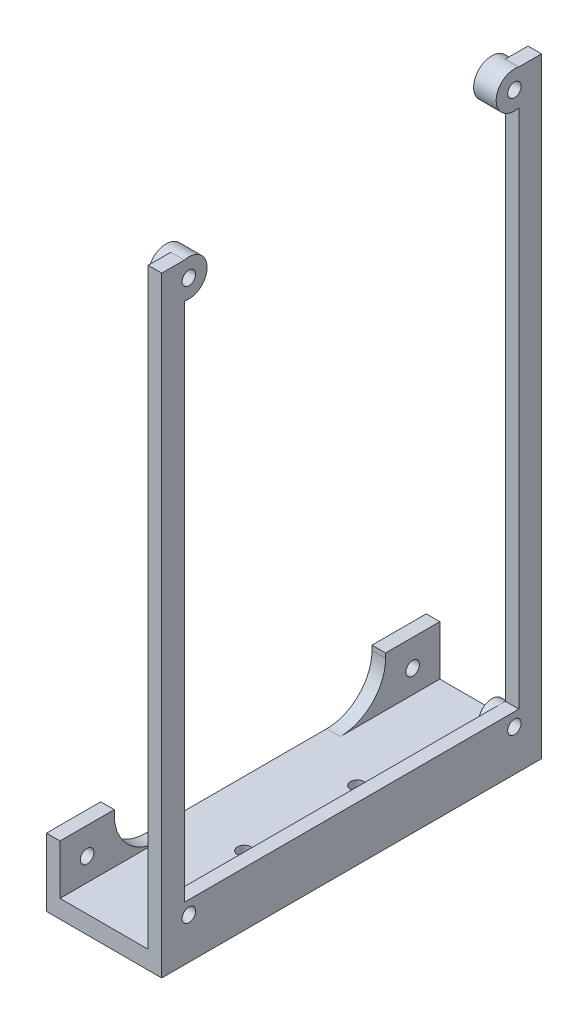
ISO-10303-21;
HEADER;
FILE_DESCRIPTION(('STEP AP214'),'2;1');
FILE_NAME('part.step','',(''),(''),'','','');
FILE_SCHEMA(('AUTOMOTIVE_DESIGN { 1 0 10303 214 1 1 1 1 }'));
ENDSEC;
DATA;
#1=APPLICATION_CONTEXT('core data for automotive mechanical design processes');
#2=APPLICATION_PROTOCOL_DEFINITION('international standard','automotive_design',2000,#1);
#3=PRODUCT_CONTEXT('',#1,'mechanical');
#4=PRODUCT('Part','Part','',(#3));
#5=PRODUCT_RELATED_PRODUCT_CATEGORY('part','',(#4));
#6=PRODUCT_DEFINITION_FORMATION('','',#4);
#7=PRODUCT_DEFINITION_CONTEXT('part definition',#1,'design');
#8=PRODUCT_DEFINITION('design','',#6,#7);
#9=PRODUCT_DEFINITION_SHAPE('','',#8);
#10=(LENGTH_UNIT() NAMED_UNIT(*) SI_UNIT(.MILLI.,.METRE.));
#11=(NAMED_UNIT(*) PLANE_ANGLE_UNIT() SI_UNIT($,.RADIAN.));
#12=(NAMED_UNIT(*) SI_UNIT($,.STERADIAN.) SOLID_ANGLE_UNIT());
#13=UNCERTAINTY_MEASURE_WITH_UNIT(LENGTH_MEASURE(1.E-05),#10,'distance_accuracy_value','');
#14=(GEOMETRIC_REPRESENTATION_CONTEXT(3) GLOBAL_UNCERTAINTY_ASSIGNED_CONTEXT((#13)) GLOBAL_UNIT_ASSIGNED_CONTEXT((#10,
#11,#12)) REPRESENTATION_CONTEXT('',''));
#15=CARTESIAN_POINT('',(0.,0.,0.));
#16=DIRECTION('',(0.,0.,1.));
#17=DIRECTION('',(1.,0.,0.));
#18=AXIS2_PLACEMENT_3D('',#15,#16,#17);
#19=CARTESIAN_POINT('',(0.,126.085239247511,78.));
#20=DIRECTION('',(1.,0.,0.));
#21=DIRECTION('',(0.,0.,-1.));
#22=AXIS2_PLACEMENT_3D('',#19,#20,#21);
#23=PLANE('',#22);
#24=DIRECTION('',(0.,0.,-1.));
#25=VECTOR('',#24,1.);
#26=CARTESIAN_POINT('',(0.,-1.,0.));
#27=LINE('',#26,#25);
#28=CARTESIAN_POINT('',(0.,-1.,84.));
#29=VERTEX_POINT('',#28);
#30=CARTESIAN_POINT('',(0.,-1.,0.));
#31=VERTEX_POINT('',#30);
#32=EDGE_CURVE('E287',#29,#31,#27,.T.);
#33=ORIENTED_EDGE('',*,*,#32,.F.);
#34=DIRECTION('',(0.,-1.,0.));
#35=VECTOR('',#34,1.);
#36=CARTESIAN_POINT('',(0.,-5.,84.));
#37=LINE('',#36,#35);
#38=CARTESIAN_POINT('',(0.,130.,84.));
#39=VERTEX_POINT('',#38);
#40=EDGE_CURVE('E354',#39,#29,#37,.T.);
#41=ORIENTED_EDGE('',*,*,#40,.F.);
#42=DIRECTION('',(0.,0.,1.));
#43=VECTOR('',#42,1.);
#44=CARTESIAN_POINT('',(0.,130.,84.));
#45=LINE('',#44,#43);
#46=CARTESIAN_POINT('',(0.,130.,79.0000000000001));
#47=VERTEX_POINT('',#46);
#48=EDGE_CURVE('E386',#47,#39,#45,.T.);
#49=ORIENTED_EDGE('',*,*,#48,.F.);
#50=CARTESIAN_POINT('',(0.,126.085239247511,78.));
#51=DIRECTION('',(-1.,0.,0.));
#52=DIRECTION('',(0.,0.,1.));
#53=AXIS2_PLACEMENT_3D('',#50,#51,#52);
#54=CIRCLE('',#53,4.04046429871923);
#55=CARTESIAN_POINT('',(0.,122.170478495023,79.));
#56=VERTEX_POINT('',#55);
#57=EDGE_CURVE('E11',#56,#47,#54,.T.);
#58=ORIENTED_EDGE('',*,*,#57,.F.);
#59=DIRECTION('',(0.,1.,0.));
#60=VECTOR('',#59,1.);
#61=CARTESIAN_POINT('',(0.,7.,79.));
#62=LINE('',#61,#60);
#63=CARTESIAN_POINT('',(0.,7.,79.));
#64=VERTEX_POINT('',#63);
#65=EDGE_CURVE('E382',#64,#56,#62,.T.);
#66=ORIENTED_EDGE('',*,*,#65,.F.);
#67=DIRECTION('',(0.,0.,1.));
#68=VECTOR('',#67,1.);
#69=CARTESIAN_POINT('',(0.,7.,5.));
#70=LINE('',#69,#68);
#71=CARTESIAN_POINT('',(0.,7.,78.));
#72=VERTEX_POINT('',#71);
#73=EDGE_CURVE('E379',#72,#64,#70,.T.);
#74=ORIENTED_EDGE('',*,*,#73,.F.);
#75=CARTESIAN_POINT('',(0.,4.08523924751169,78.));
#76=DIRECTION('',(-1.,0.,0.));
#77=DIRECTION('',(0.,0.,1.));
#78=AXIS2_PLACEMENT_3D('',#75,#76,#77);
#79=CIRCLE('',#78,2.91476075248831);
#80=EDGE_CURVE('E322',#72,#72,#79,.T.);
#81=ORIENTED_EDGE('',*,*,#80,.F.);
#82=CARTESIAN_POINT('',(0.,7.,6.00000000000001));
#83=VERTEX_POINT('',#82);
#84=EDGE_CURVE('E383',#83,#72,#70,.T.);
#85=ORIENTED_EDGE('',*,*,#84,.F.);
#86=CARTESIAN_POINT('',(0.,4.08523924751171,6.00000000000001));
#87=DIRECTION('',(-1.,0.,0.));
#88=DIRECTION('',(0.,0.,1.));
#89=AXIS2_PLACEMENT_3D('',#86,#87,#88);
#90=CIRCLE('',#89,2.91476075248829);
#91=EDGE_CURVE('E313',#83,#83,#90,.T.);
#92=ORIENTED_EDGE('',*,*,#91,.F.);
#93=CARTESIAN_POINT('',(0.,7.,5.));
#94=VERTEX_POINT('',#93);
#95=EDGE_CURVE('E380',#94,#83,#70,.T.);
#96=ORIENTED_EDGE('',*,*,#95,.F.);
#97=DIRECTION('',(0.,-1.,0.));
#98=VECTOR('',#97,1.);
#99=CARTESIAN_POINT('',(0.,7.,5.));
#100=LINE('',#99,#98);
#101=CARTESIAN_POINT('',(0.,122.170478495023,5.00000000000001));
#102=VERTEX_POINT('',#101);
#103=EDGE_CURVE('E377',#102,#94,#100,.T.);
#104=ORIENTED_EDGE('',*,*,#103,.F.);
#105=CARTESIAN_POINT('',(0.,126.085239247511,6.00000000000001));
#106=DIRECTION('',(-1.,0.,0.));
#107=DIRECTION('',(0.,0.,1.));
#108=AXIS2_PLACEMENT_3D('',#105,#106,#107);
#109=CIRCLE('',#108,4.04046429871923);
#110=CARTESIAN_POINT('',(0.,130.,4.99999999999999));
#111=VERTEX_POINT('',#110);
#112=EDGE_CURVE('E300',#111,#102,#109,.T.);
#113=ORIENTED_EDGE('',*,*,#112,.F.);
#114=DIRECTION('',(0.,0.,1.));
#115=VECTOR('',#114,1.);
#116=CARTESIAN_POINT('',(0.,130.,0.));
#117=LINE('',#116,#115);
#118=CARTESIAN_POINT('',(0.,130.,0.));
#119=VERTEX_POINT('',#118);
#120=EDGE_CURVE('E374',#119,#111,#117,.T.);
#121=ORIENTED_EDGE('',*,*,#120,.F.);
#122=DIRECTION('',(0.,1.,0.));
#123=VECTOR('',#122,1.);
#124=CARTESIAN_POINT('',(0.,12.5662912876412,0.));
#125=LINE('',#124,#123);
#126=EDGE_CURVE('E349',#31,#119,#125,.T.);
#127=ORIENTED_EDGE('',*,*,#126,.F.);
#128=EDGE_LOOP('',(#33,#41,#49,#58,#66,#74,#81,#85,#92,#96,#104,#113,#121,#127));
#129=FACE_BOUND('',#128,.T.);
#130=ADVANCED_FACE('F47',(#129),#23,.F.);
#131=CARTESIAN_POINT('',(0.,126.085239247511,6.00000000000001));
#132=DIRECTION('',(1.,0.,0.));
#133=DIRECTION('',(0.,0.,-1.));
#134=AXIS2_PLACEMENT_3D('',#131,#132,#133);
#135=CIRCLE('',#134,1.50000000000003);
#136=CARTESIAN_POINT('',(0.,126.085239247511,4.49999999999998));
#137=VERTEX_POINT('',#136);
#138=EDGE_CURVE('E340',#137,#137,#135,.T.);
#139=ORIENTED_EDGE('',*,*,#138,.T.);
#140=EDGE_LOOP('',(#139));
#141=FACE_BOUND('',#140,.T.);
#142=CARTESIAN_POINT('',(0.,126.085239247511,6.00000000000001));
#143=DIRECTION('',(-1.,0.,0.));
#144=DIRECTION('',(0.,0.,1.));
#145=AXIS2_PLACEMENT_3D('',#142,#143,#144);
#146=CIRCLE('',#145,1.50449978247794);
#147=CARTESIAN_POINT('',(0.,126.085239247511,7.50449978247794));
#148=VERTEX_POINT('',#147);
#149=EDGE_CURVE('E307',#148,#148,#146,.T.);
#150=ORIENTED_EDGE('',*,*,#149,.T.);
#151=EDGE_LOOP('',(#150));
#152=FACE_BOUND('',#151,.T.);
#153=ADVANCED_FACE('F469',(#141,#152),#23,.F.);
#154=CARTESIAN_POINT('',(3.,126.085239247511,78.));
#155=DIRECTION('',(1.,0.,0.));
#156=DIRECTION('',(0.,0.,-1.));
#157=AXIS2_PLACEMENT_3D('',#154,#155,#156);
#158=PLANE('',#157);
#159=CARTESIAN_POINT('',(3.,126.085239247511,78.));
#160=DIRECTION('',(1.,0.,0.));
#161=DIRECTION('',(0.,0.,-1.));
#162=AXIS2_PLACEMENT_3D('',#159,#160,#161);
#163=CIRCLE('',#162,1.5);
#164=CARTESIAN_POINT('',(3.,126.085239247511,76.5));
#165=VERTEX_POINT('',#164);
#166=EDGE_CURVE('E337',#165,#165,#163,.T.);
#167=ORIENTED_EDGE('',*,*,#166,.F.);
#168=EDGE_LOOP('',(#167));
#169=FACE_BOUND('',#168,.T.);
#170=CARTESIAN_POINT('',(3.,4.08523924751171,6.00000000000001));
#171=DIRECTION('',(1.,0.,0.));
#172=DIRECTION('',(0.,0.,-1.));
#173=AXIS2_PLACEMENT_3D('',#170,#171,#172);
#174=CIRCLE('',#173,1.5);
#175=CARTESIAN_POINT('',(3.,4.08523924751171,4.50000000000001));
#176=VERTEX_POINT('',#175);
#177=EDGE_CURVE('E344',#176,#176,#174,.T.);
#178=ORIENTED_EDGE('',*,*,#177,.F.);
#179=EDGE_LOOP('',(#178));
#180=FACE_BOUND('',#179,.T.);
#181=DIRECTION('',(0.,0.,-1.));
#182=VECTOR('',#181,1.);
#183=CARTESIAN_POINT('',(3.,-5.,0.));
#184=LINE('',#183,#182);
#185=CARTESIAN_POINT('',(3.,-5.,84.));
#186=VERTEX_POINT('',#185);
#187=CARTESIAN_POINT('',(3.,-5.,0.));
#188=VERTEX_POINT('',#187);
#189=EDGE_CURVE('E350',#186,#188,#184,.T.);
#190=ORIENTED_EDGE('',*,*,#189,.T.);
#191=DIRECTION('',(0.,1.,0.));
#192=VECTOR('',#191,1.);
#193=CARTESIAN_POINT('',(3.,-5.,0.));
#194=LINE('',#193,#192);
#195=CARTESIAN_POINT('',(3.,130.,0.));
#196=VERTEX_POINT('',#195);
#197=EDGE_CURVE('E353',#188,#196,#194,.T.);
#198=ORIENTED_EDGE('',*,*,#197,.T.);
#199=DIRECTION('',(0.,0.,1.));
#200=VECTOR('',#199,1.);
#201=CARTESIAN_POINT('',(3.,130.,0.));
#202=LINE('',#201,#200);
#203=CARTESIAN_POINT('',(3.,130.,5.));
#204=VERTEX_POINT('',#203);
#205=EDGE_CURVE('E356',#196,#204,#202,.T.);
#206=ORIENTED_EDGE('',*,*,#205,.T.);
#207=CARTESIAN_POINT('',(3.,126.085239247511,6.00000000000001));
#208=DIRECTION('',(1.,0.,0.));
#209=DIRECTION('',(0.,0.,-1.));
#210=AXIS2_PLACEMENT_3D('',#207,#208,#209);
#211=CIRCLE('',#210,4.04046429871923);
#212=CARTESIAN_POINT('',(3.,122.170478495023,5.00000000000001));
#213=VERTEX_POINT('',#212);
#214=EDGE_CURVE('E358',#204,#213,#211,.T.);
#215=ORIENTED_EDGE('',*,*,#214,.T.);
#216=DIRECTION('',(0.,-1.,0.));
#217=VECTOR('',#216,1.);
#218=CARTESIAN_POINT('',(3.,7.,5.));
#219=LINE('',#218,#217);
#220=CARTESIAN_POINT('',(3.,7.,5.));
#221=VERTEX_POINT('',#220);
#222=EDGE_CURVE('E360',#213,#221,#219,.T.);
#223=ORIENTED_EDGE('',*,*,#222,.T.);
#224=DIRECTION('',(0.,0.,1.));
#225=VECTOR('',#224,1.);
#226=CARTESIAN_POINT('',(3.,7.,5.));
#227=LINE('',#226,#225);
#228=CARTESIAN_POINT('',(3.,7.,79.));
#229=VERTEX_POINT('',#228);
#230=EDGE_CURVE('E362',#221,#229,#227,.T.);
#231=ORIENTED_EDGE('',*,*,#230,.T.);
#232=DIRECTION('',(0.,1.,0.));
#233=VECTOR('',#232,1.);
#234=CARTESIAN_POINT('',(3.,7.,79.));
#235=LINE('',#234,#233);
#236=CARTESIAN_POINT('',(3.,122.170478495023,79.));
#237=VERTEX_POINT('',#236);
#238=EDGE_CURVE('E364',#229,#237,#235,.T.);
#239=ORIENTED_EDGE('',*,*,#238,.T.);
#240=CARTESIAN_POINT('',(3.,126.085239247511,78.));
#241=DIRECTION('',(1.,0.,0.));
#242=DIRECTION('',(0.,0.,-1.));
#243=AXIS2_PLACEMENT_3D('',#240,#241,#242);
#244=CIRCLE('',#243,4.04046429871923);
#245=CARTESIAN_POINT('',(3.,130.,79.));
#246=VERTEX_POINT('',#245);
#247=EDGE_CURVE('E366',#237,#246,#244,.T.);
#248=ORIENTED_EDGE('',*,*,#247,.T.);
#249=DIRECTION('',(0.,0.,1.));
#250=VECTOR('',#249,1.);
#251=CARTESIAN_POINT('',(3.,130.,84.));
#252=LINE('',#251,#250);
#253=CARTESIAN_POINT('',(3.,130.,84.));
#254=VERTEX_POINT('',#253);
#255=EDGE_CURVE('E368',#246,#254,#252,.T.);
#256=ORIENTED_EDGE('',*,*,#255,.T.);
#257=DIRECTION('',(0.,-1.,0.));
#258=VECTOR('',#257,1.);
#259=CARTESIAN_POINT('',(3.,12.5662912876412,84.));
#260=LINE('',#259,#258);
#261=EDGE_CURVE('E370',#254,#186,#260,.T.);
#262=ORIENTED_EDGE('',*,*,#261,.T.);
#263=EDGE_LOOP('',(#190,#198,#206,#215,#223,#231,#239,#248,#256,#262));
#264=FACE_BOUND('',#263,.T.);
#265=CARTESIAN_POINT('',(3.,126.085239247511,6.00000000000001));
#266=DIRECTION('',(1.,0.,0.));
#267=DIRECTION('',(0.,0.,-1.));
#268=AXIS2_PLACEMENT_3D('',#265,#266,#267);
#269=CIRCLE('',#268,1.50000000000003);
#270=CARTESIAN_POINT('',(3.,126.085239247511,4.49999999999998));
#271=VERTEX_POINT('',#270);
#272=EDGE_CURVE('E341',#271,#271,#269,.T.);
#273=ORIENTED_EDGE('',*,*,#272,.F.);
#274=EDGE_LOOP('',(#273));
#275=FACE_BOUND('',#274,.T.);
#276=CARTESIAN_POINT('',(3.,4.08523924751169,78.));
#277=DIRECTION('',(1.,0.,0.));
#278=DIRECTION('',(0.,0.,-1.));
#279=AXIS2_PLACEMENT_3D('',#276,#277,#278);
#280=CIRCLE('',#279,1.5);
#281=CARTESIAN_POINT('',(3.,4.08523924751169,76.5));
#282=VERTEX_POINT('',#281);
#283=EDGE_CURVE('E333',#282,#282,#280,.T.);
#284=ORIENTED_EDGE('',*,*,#283,.F.);
#285=EDGE_LOOP('',(#284));
#286=FACE_BOUND('',#285,.T.);
#287=ADVANCED_FACE('F476',(#169,#180,#264,#275,#286),#158,.T.);
#288=CARTESIAN_POINT('',(3.,-5.,0.));
#289=DIRECTION('',(0.,1.,0.));
#290=DIRECTION('',(0.,0.,1.));
#291=AXIS2_PLACEMENT_3D('',#288,#289,#290);
#292=PLANE('',#291);
#293=CARTESIAN_POINT('',(-8.25,-5.,29.5));
#294=DIRECTION('',(0.,-1.,0.));
#295=DIRECTION('',(0.,0.,-1.));
#296=AXIS2_PLACEMENT_3D('',#293,#294,#295);
#297=CIRCLE('',#296,1.5);
#298=CARTESIAN_POINT('',(-8.25,-5.,28.));
#299=VERTEX_POINT('',#298);
#300=EDGE_CURVE('E280',#299,#299,#297,.T.);
#301=ORIENTED_EDGE('',*,*,#300,.F.);
#302=EDGE_LOOP('',(#301));
#303=FACE_BOUND('',#302,.T.);
#304=CARTESIAN_POINT('',(-8.25000000000009,-5.,54.5));
#305=DIRECTION('',(0.,-1.,0.));
#306=DIRECTION('',(0.,0.,-1.));
#307=AXIS2_PLACEMENT_3D('',#304,#305,#306);
#308=CIRCLE('',#307,1.5);
#309=CARTESIAN_POINT('',(-8.25000000000009,-5.,53.));
#310=VERTEX_POINT('',#309);
#311=EDGE_CURVE('E284',#310,#310,#308,.T.);
#312=ORIENTED_EDGE('',*,*,#311,.F.);
#313=EDGE_LOOP('',(#312));
#314=FACE_BOUND('',#313,.T.);
#315=DIRECTION('',(-1.,0.,0.));
#316=VECTOR('',#315,1.);
#317=CARTESIAN_POINT('',(3.,-5.,84.));
#318=LINE('',#317,#316);
#319=CARTESIAN_POINT('',(-22.5,-5.,84.));
#320=VERTEX_POINT('',#319);
#321=EDGE_CURVE('E372',#186,#320,#318,.T.);
#322=ORIENTED_EDGE('',*,*,#321,.T.);
#323=DIRECTION('',(0.,0.,1.));
#324=VECTOR('',#323,1.);
#325=CARTESIAN_POINT('',(-22.5,-5.,0.));
#326=LINE('',#325,#324);
#327=CARTESIAN_POINT('',(-22.5,-5.,0.));
#328=VERTEX_POINT('',#327);
#329=EDGE_CURVE('E229',#328,#320,#326,.T.);
#330=ORIENTED_EDGE('',*,*,#329,.F.);
#331=DIRECTION('',(-1.,0.,0.));
#332=VECTOR('',#331,1.);
#333=CARTESIAN_POINT('',(3.,-5.,0.));
#334=LINE('',#333,#332);
#335=EDGE_CURVE('E51',#188,#328,#334,.T.);
#336=ORIENTED_EDGE('',*,*,#335,.F.);
#337=ORIENTED_EDGE('',*,*,#189,.F.);
#338=EDGE_LOOP('',(#322,#330,#336,#337));
#339=FACE_BOUND('',#338,.T.);
#340=ADVANCED_FACE('F49',(#303,#314,#339),#292,.F.);
#341=CARTESIAN_POINT('',(3.,12.5662912876412,0.));
#342=DIRECTION('',(0.,0.,1.));
#343=DIRECTION('',(1.,0.,0.));
#344=AXIS2_PLACEMENT_3D('',#341,#342,#343);
#345=PLANE('',#344);
#346=ORIENTED_EDGE('',*,*,#335,.T.);
#347=DIRECTION('',(0.,-1.,0.));
#348=VECTOR('',#347,1.);
#349=CARTESIAN_POINT('',(-22.5,0.,0.));
#350=LINE('',#349,#348);
#351=CARTESIAN_POINT('',(-22.5,10.,0.));
#352=VERTEX_POINT('',#351);
#353=EDGE_CURVE('E226',#352,#328,#350,.T.);
#354=ORIENTED_EDGE('',*,*,#353,.F.);
#355=DIRECTION('',(1.,0.,0.));
#356=VECTOR('',#355,1.);
#357=CARTESIAN_POINT('',(-22.5,10.,0.));
#358=LINE('',#357,#356);
#359=CARTESIAN_POINT('',(-19.5,10.,0.));
#360=VERTEX_POINT('',#359);
#361=EDGE_CURVE('E272',#352,#360,#358,.T.);
#362=ORIENTED_EDGE('',*,*,#361,.T.);
#363=DIRECTION('',(0.,-1.,0.));
#364=VECTOR('',#363,1.);
#365=CARTESIAN_POINT('',(-19.5,0.,0.));
#366=LINE('',#365,#364);
#367=CARTESIAN_POINT('',(-19.5,-1.,0.));
#368=VERTEX_POINT('',#367);
#369=EDGE_CURVE('E253',#360,#368,#366,.T.);
#370=ORIENTED_EDGE('',*,*,#369,.T.);
#371=DIRECTION('',(1.,0.,0.));
#372=VECTOR('',#371,1.);
#373=CARTESIAN_POINT('',(-19.5,-1.,0.));
#374=LINE('',#373,#372);
#375=EDGE_CURVE('E293',#368,#31,#374,.T.);
#376=ORIENTED_EDGE('',*,*,#375,.T.);
#377=ORIENTED_EDGE('',*,*,#126,.T.);
#378=DIRECTION('',(-1.,0.,0.));
#379=VECTOR('',#378,1.);
#380=CARTESIAN_POINT('',(3.,130.,0.));
#381=LINE('',#380,#379);
#382=EDGE_CURVE('E412',#196,#119,#381,.T.);
#383=ORIENTED_EDGE('',*,*,#382,.F.);
#384=ORIENTED_EDGE('',*,*,#197,.F.);
#385=EDGE_LOOP('',(#346,#354,#362,#370,#376,#377,#383,#384));
#386=FACE_BOUND('',#385,.T.);
#387=ADVANCED_FACE('F421',(#386),#345,.F.);
#388=CARTESIAN_POINT('',(3.,130.,0.));
#389=DIRECTION('',(0.,-1.,0.));
#390=DIRECTION('',(0.,0.,-1.));
#391=AXIS2_PLACEMENT_3D('',#388,#389,#390);
#392=PLANE('',#391);
#393=ORIENTED_EDGE('',*,*,#120,.T.);
#394=DIRECTION('',(-1.,0.,0.));
#395=VECTOR('',#394,1.);
#396=CARTESIAN_POINT('',(3.,130.,5.));
#397=LINE('',#396,#395);
#398=EDGE_CURVE('E410',#204,#111,#397,.T.);
#399=ORIENTED_EDGE('',*,*,#398,.F.);
#400=ORIENTED_EDGE('',*,*,#205,.F.);
#401=ORIENTED_EDGE('',*,*,#382,.T.);
#402=EDGE_LOOP('',(#393,#399,#400,#401));
#403=FACE_BOUND('',#402,.T.);
#404=ADVANCED_FACE('F507',(#403),#392,.F.);
#405=CARTESIAN_POINT('',(3.,126.085239247511,6.00000000000001));
#406=DIRECTION('',(-1.,0.,0.));
#407=DIRECTION('',(0.,0.,1.));
#408=AXIS2_PLACEMENT_3D('',#405,#406,#407);
#409=CYLINDRICAL_SURFACE('',#408,4.04046429871923);
#410=ORIENTED_EDGE('',*,*,#398,.T.);
#411=ORIENTED_EDGE('',*,*,#112,.T.);
#412=DIRECTION('',(-1.,0.,0.));
#413=VECTOR('',#412,1.);
#414=CARTESIAN_POINT('',(3.,122.170478495023,5.00000000000001));
#415=LINE('',#414,#413);
#416=EDGE_CURVE('E407',#213,#102,#415,.T.);
#417=ORIENTED_EDGE('',*,*,#416,.F.);
#418=ORIENTED_EDGE('',*,*,#214,.F.);
#419=EDGE_LOOP('',(#410,#411,#417,#418));
#420=FACE_BOUND('',#419,.T.);
#421=CARTESIAN_POINT('',(-2.,126.085239247511,6.00000000000001));
#422=DIRECTION('',(-1.,0.,0.));
#423=DIRECTION('',(0.,0.,1.));
#424=AXIS2_PLACEMENT_3D('',#421,#422,#423);
#425=CIRCLE('',#424,4.04046429871923);
#426=CARTESIAN_POINT('',(-2.,126.085239247511,10.0404642987192));
#427=VERTEX_POINT('',#426);
#428=EDGE_CURVE('E303',#427,#427,#425,.T.);
#429=ORIENTED_EDGE('',*,*,#428,.F.);
#430=EDGE_LOOP('',(#429));
#431=FACE_BOUND('',#430,.T.);
#432=ADVANCED_FACE('F503',(#420,#431),#409,.T.);
#433=CARTESIAN_POINT('',(3.,7.,5.));
#434=DIRECTION('',(0.,0.,-1.));
#435=DIRECTION('',(-1.,0.,0.));
#436=AXIS2_PLACEMENT_3D('',#433,#434,#435);
#437=PLANE('',#436);
#438=ORIENTED_EDGE('',*,*,#103,.T.);
#439=DIRECTION('',(-1.,0.,0.));
#440=VECTOR('',#439,1.);
#441=CARTESIAN_POINT('',(3.,7.,5.));
#442=LINE('',#441,#440);
#443=EDGE_CURVE('E404',#221,#94,#442,.T.);
#444=ORIENTED_EDGE('',*,*,#443,.F.);
#445=ORIENTED_EDGE('',*,*,#222,.F.);
#446=ORIENTED_EDGE('',*,*,#416,.T.);
#447=EDGE_LOOP('',(#438,#444,#445,#446));
#448=FACE_BOUND('',#447,.T.);
#449=ADVANCED_FACE('F499',(#448),#437,.F.);
#450=CARTESIAN_POINT('',(3.,7.,5.));
#451=DIRECTION('',(0.,-1.,0.));
#452=DIRECTION('',(0.,0.,-1.));
#453=AXIS2_PLACEMENT_3D('',#450,#451,#452);
#454=PLANE('',#453);
#455=ORIENTED_EDGE('',*,*,#95,.T.);
#456=ORIENTED_EDGE('',*,*,#84,.T.);
#457=ORIENTED_EDGE('',*,*,#73,.T.);
#458=DIRECTION('',(-1.,0.,0.));
#459=VECTOR('',#458,1.);
#460=CARTESIAN_POINT('',(3.,7.,79.));
#461=LINE('',#460,#459);
#462=EDGE_CURVE('E401',#229,#64,#461,.T.);
#463=ORIENTED_EDGE('',*,*,#462,.F.);
#464=ORIENTED_EDGE('',*,*,#230,.F.);
#465=ORIENTED_EDGE('',*,*,#443,.T.);
#466=EDGE_LOOP('',(#455,#456,#457,#463,#464,#465));
#467=FACE_BOUND('',#466,.T.);
#468=ADVANCED_FACE('F495',(#467),#454,.F.);
#469=CARTESIAN_POINT('',(3.,7.,79.));
#470=DIRECTION('',(0.,0.,1.));
#471=DIRECTION('',(1.,0.,0.));
#472=AXIS2_PLACEMENT_3D('',#469,#470,#471);
#473=PLANE('',#472);
#474=ORIENTED_EDGE('',*,*,#65,.T.);
#475=DIRECTION('',(-1.,0.,0.));
#476=VECTOR('',#475,1.);
#477=CARTESIAN_POINT('',(3.,122.170478495023,79.));
#478=LINE('',#477,#476);
#479=EDGE_CURVE('E398',#237,#56,#478,.T.);
#480=ORIENTED_EDGE('',*,*,#479,.F.);
#481=ORIENTED_EDGE('',*,*,#238,.F.);
#482=ORIENTED_EDGE('',*,*,#462,.T.);
#483=EDGE_LOOP('',(#474,#480,#481,#482));
#484=FACE_BOUND('',#483,.T.);
#485=ADVANCED_FACE('F491',(#484),#473,.F.);
#486=CARTESIAN_POINT('',(3.,126.085239247511,78.));
#487=DIRECTION('',(-1.,0.,0.));
#488=DIRECTION('',(0.,0.,1.));
#489=AXIS2_PLACEMENT_3D('',#486,#487,#488);
#490=CYLINDRICAL_SURFACE('',#489,4.04046429871923);
#491=ORIENTED_EDGE('',*,*,#479,.T.);
#492=ORIENTED_EDGE('',*,*,#57,.T.);
#493=DIRECTION('',(-1.,0.,0.));
#494=VECTOR('',#493,1.);
#495=CARTESIAN_POINT('',(3.,130.,79.));
#496=LINE('',#495,#494);
#497=EDGE_CURVE('E395',#246,#47,#496,.T.);
#498=ORIENTED_EDGE('',*,*,#497,.F.);
#499=ORIENTED_EDGE('',*,*,#247,.F.);
#500=EDGE_LOOP('',(#491,#492,#498,#499));
#501=FACE_BOUND('',#500,.T.);
#502=CARTESIAN_POINT('',(-2.,126.085239247511,78.));
#503=DIRECTION('',(-1.,0.,0.));
#504=DIRECTION('',(0.,0.,1.));
#505=AXIS2_PLACEMENT_3D('',#502,#503,#504);
#506=CIRCLE('',#505,4.04046429871923);
#507=CARTESIAN_POINT('',(-2.,126.085239247511,82.0404642987192));
#508=VERTEX_POINT('',#507);
#509=EDGE_CURVE('E331',#508,#508,#506,.T.);
#510=ORIENTED_EDGE('',*,*,#509,.F.);
#511=EDGE_LOOP('',(#510));
#512=FACE_BOUND('',#511,.T.);
#513=ADVANCED_FACE('F487',(#501,#512),#490,.T.);
#514=CARTESIAN_POINT('',(3.,130.,84.));
#515=DIRECTION('',(0.,-1.,0.));
#516=DIRECTION('',(0.,0.,-1.));
#517=AXIS2_PLACEMENT_3D('',#514,#515,#516);
#518=PLANE('',#517);
#519=ORIENTED_EDGE('',*,*,#48,.T.);
#520=DIRECTION('',(-1.,0.,0.));
#521=VECTOR('',#520,1.);
#522=CARTESIAN_POINT('',(3.,130.,84.));
#523=LINE('',#522,#521);
#524=EDGE_CURVE('E392',#254,#39,#523,.T.);
#525=ORIENTED_EDGE('',*,*,#524,.F.);
#526=ORIENTED_EDGE('',*,*,#255,.F.);
#527=ORIENTED_EDGE('',*,*,#497,.T.);
#528=EDGE_LOOP('',(#519,#525,#526,#527));
#529=FACE_BOUND('',#528,.T.);
#530=ADVANCED_FACE('F484',(#529),#518,.F.);
#531=CARTESIAN_POINT('',(3.,-5.,84.));
#532=DIRECTION('',(0.,0.,-1.));
#533=DIRECTION('',(-1.,0.,0.));
#534=AXIS2_PLACEMENT_3D('',#531,#532,#533);
#535=PLANE('',#534);
#536=ORIENTED_EDGE('',*,*,#40,.T.);
#537=DIRECTION('',(1.,0.,0.));
#538=VECTOR('',#537,1.);
#539=CARTESIAN_POINT('',(-19.5,-1.,84.));
#540=LINE('',#539,#538);
#541=CARTESIAN_POINT('',(-19.5,-1.,84.));
#542=VERTEX_POINT('',#541);
#543=EDGE_CURVE('E297',#542,#29,#540,.T.);
#544=ORIENTED_EDGE('',*,*,#543,.F.);
#545=DIRECTION('',(0.,1.,0.));
#546=VECTOR('',#545,1.);
#547=CARTESIAN_POINT('',(-19.5,0.,84.));
#548=LINE('',#547,#546);
#549=CARTESIAN_POINT('',(-19.5,10.,84.));
#550=VERTEX_POINT('',#549);
#551=EDGE_CURVE('E256',#542,#550,#548,.T.);
#552=ORIENTED_EDGE('',*,*,#551,.T.);
#553=DIRECTION('',(1.,0.,0.));
#554=VECTOR('',#553,1.);
#555=CARTESIAN_POINT('',(-22.5,10.,84.));
#556=LINE('',#555,#554);
#557=CARTESIAN_POINT('',(-22.5,10.,84.));
#558=VERTEX_POINT('',#557);
#559=EDGE_CURVE('E269',#558,#550,#556,.T.);
#560=ORIENTED_EDGE('',*,*,#559,.F.);
#561=DIRECTION('',(0.,1.,0.));
#562=VECTOR('',#561,1.);
#563=CARTESIAN_POINT('',(-22.5,0.,84.));
#564=LINE('',#563,#562);
#565=EDGE_CURVE('E232',#320,#558,#564,.T.);
#566=ORIENTED_EDGE('',*,*,#565,.F.);
#567=ORIENTED_EDGE('',*,*,#321,.F.);
#568=ORIENTED_EDGE('',*,*,#261,.F.);
#569=ORIENTED_EDGE('',*,*,#524,.T.);
#570=EDGE_LOOP('',(#536,#544,#552,#560,#566,#567,#568,#569));
#571=FACE_BOUND('',#570,.T.);
#572=ADVANCED_FACE('F430',(#571),#535,.F.);
#573=CARTESIAN_POINT('',(3.,4.08523924751171,6.00000000000001));
#574=DIRECTION('',(-1.,0.,0.));
#575=DIRECTION('',(0.,0.,1.));
#576=AXIS2_PLACEMENT_3D('',#573,#574,#575);
#577=CYLINDRICAL_SURFACE('',#576,1.5);
#578=ORIENTED_EDGE('',*,*,#177,.T.);
#579=EDGE_LOOP('',(#578));
#580=FACE_BOUND('',#579,.T.);
#581=CARTESIAN_POINT('',(-2.,4.08523924751171,6.00000000000001));
#582=DIRECTION('',(-1.,0.,0.));
#583=DIRECTION('',(0.,0.,1.));
#584=AXIS2_PLACEMENT_3D('',#581,#582,#583);
#585=CIRCLE('',#584,1.5);
#586=CARTESIAN_POINT('',(-2.,4.08523924751171,7.50000000000001));
#587=VERTEX_POINT('',#586);
#588=EDGE_CURVE('E306',#587,#587,#585,.T.);
#589=ORIENTED_EDGE('',*,*,#588,.T.);
#590=EDGE_LOOP('',(#589));
#591=FACE_BOUND('',#590,.T.);
#592=ADVANCED_FACE('F483',(#580,#591),#577,.F.);
#593=CARTESIAN_POINT('',(3.,126.085239247511,6.00000000000001));
#594=DIRECTION('',(-1.,0.,0.));
#595=DIRECTION('',(0.,0.,1.));
#596=AXIS2_PLACEMENT_3D('',#593,#594,#595);
#597=CYLINDRICAL_SURFACE('',#596,1.50000000000003);
#598=ORIENTED_EDGE('',*,*,#272,.T.);
#599=EDGE_LOOP('',(#598));
#600=FACE_BOUND('',#599,.T.);
#601=ORIENTED_EDGE('',*,*,#138,.F.);
#602=EDGE_LOOP('',(#601));
#603=FACE_BOUND('',#602,.T.);
#604=ADVANCED_FACE('F573',(#600,#603),#597,.F.);
#605=CARTESIAN_POINT('',(3.,126.085239247511,78.));
#606=DIRECTION('',(-1.,0.,0.));
#607=DIRECTION('',(0.,0.,1.));
#608=AXIS2_PLACEMENT_3D('',#605,#606,#607);
#609=CYLINDRICAL_SURFACE('',#608,1.5);
#610=ORIENTED_EDGE('',*,*,#166,.T.);
#611=EDGE_LOOP('',(#610));
#612=FACE_BOUND('',#611,.T.);
#613=CARTESIAN_POINT('',(-2.,126.085239247511,78.));
#614=DIRECTION('',(-1.,0.,0.));
#615=DIRECTION('',(0.,0.,1.));
#616=AXIS2_PLACEMENT_3D('',#613,#614,#615);
#617=CIRCLE('',#616,1.5);
#618=CARTESIAN_POINT('',(-2.,126.085239247511,79.5));
#619=VERTEX_POINT('',#618);
#620=EDGE_CURVE('E310',#619,#619,#617,.T.);
#621=ORIENTED_EDGE('',*,*,#620,.T.);
#622=EDGE_LOOP('',(#621));
#623=FACE_BOUND('',#622,.T.);
#624=ADVANCED_FACE('F569',(#612,#623),#609,.F.);
#625=CARTESIAN_POINT('',(3.,4.08523924751169,78.));
#626=DIRECTION('',(-1.,0.,0.));
#627=DIRECTION('',(0.,0.,1.));
#628=AXIS2_PLACEMENT_3D('',#625,#626,#627);
#629=CYLINDRICAL_SURFACE('',#628,1.5);
#630=ORIENTED_EDGE('',*,*,#283,.T.);
#631=EDGE_LOOP('',(#630));
#632=FACE_BOUND('',#631,.T.);
#633=CARTESIAN_POINT('',(-2.,4.08523924751169,78.));
#634=DIRECTION('',(-1.,0.,0.));
#635=DIRECTION('',(0.,0.,1.));
#636=AXIS2_PLACEMENT_3D('',#633,#634,#635);
#637=CIRCLE('',#636,1.50000000000001);
#638=CARTESIAN_POINT('',(-2.,4.08523924751169,79.5));
#639=VERTEX_POINT('',#638);
#640=EDGE_CURVE('E319',#639,#639,#637,.T.);
#641=ORIENTED_EDGE('',*,*,#640,.T.);
#642=EDGE_LOOP('',(#641));
#643=FACE_BOUND('',#642,.T.);
#644=ADVANCED_FACE('F565',(#632,#643),#629,.F.);
#645=CARTESIAN_POINT('',(-2.,126.085239247511,78.));
#646=DIRECTION('',(-1.,0.,0.));
#647=DIRECTION('',(0.,0.,1.));
#648=AXIS2_PLACEMENT_3D('',#645,#646,#647);
#649=PLANE('',#648);
#650=ORIENTED_EDGE('',*,*,#509,.T.);
#651=EDGE_LOOP('',(#650));
#652=FACE_BOUND('',#651,.T.);
#653=ORIENTED_EDGE('',*,*,#620,.F.);
#654=EDGE_LOOP('',(#653));
#655=FACE_BOUND('',#654,.T.);
#656=ADVANCED_FACE('F547',(#652,#655),#649,.T.);
#657=CARTESIAN_POINT('',(-2.,126.085239247511,6.00000000000001));
#658=DIRECTION('',(-1.,0.,0.));
#659=DIRECTION('',(0.,0.,1.));
#660=AXIS2_PLACEMENT_3D('',#657,#658,#659);
#661=PLANE('',#660);
#662=ORIENTED_EDGE('',*,*,#428,.T.);
#663=EDGE_LOOP('',(#662));
#664=FACE_BOUND('',#663,.T.);
#665=CARTESIAN_POINT('',(-2.,126.085239247511,6.00000000000001));
#666=DIRECTION('',(-1.,0.,0.));
#667=DIRECTION('',(0.,0.,1.));
#668=AXIS2_PLACEMENT_3D('',#665,#666,#667);
#669=CIRCLE('',#668,1.50449978247794);
#670=CARTESIAN_POINT('',(-2.,126.085239247511,7.50449978247794));
#671=VERTEX_POINT('',#670);
#672=EDGE_CURVE('E302',#671,#671,#669,.T.);
#673=ORIENTED_EDGE('',*,*,#672,.F.);
#674=EDGE_LOOP('',(#673));
#675=FACE_BOUND('',#674,.T.);
#676=ADVANCED_FACE('F543',(#664,#675),#661,.T.);
#677=CARTESIAN_POINT('',(-2.,126.085239247511,6.00000000000001));
#678=DIRECTION('',(1.,0.,0.));
#679=DIRECTION('',(0.,0.,-1.));
#680=AXIS2_PLACEMENT_3D('',#677,#678,#679);
#681=CYLINDRICAL_SURFACE('',#680,1.50449978247794);
#682=ORIENTED_EDGE('',*,*,#672,.T.);
#683=EDGE_LOOP('',(#682));
#684=FACE_BOUND('',#683,.T.);
#685=ORIENTED_EDGE('',*,*,#149,.F.);
#686=EDGE_LOOP('',(#685));
#687=FACE_BOUND('',#686,.T.);
#688=ADVANCED_FACE('F546',(#684,#687),#681,.F.);
#689=CARTESIAN_POINT('',(-2.,4.08523924751171,6.00000000000001));
#690=DIRECTION('',(-1.,0.,0.));
#691=DIRECTION('',(0.,0.,1.));
#692=AXIS2_PLACEMENT_3D('',#689,#690,#691);
#693=PLANE('',#692);
#694=CARTESIAN_POINT('',(-2.,4.08523924751171,6.00000000000001));
#695=DIRECTION('',(-1.,0.,0.));
#696=DIRECTION('',(0.,0.,1.));
#697=AXIS2_PLACEMENT_3D('',#694,#695,#696);
#698=CIRCLE('',#697,2.91476075248829);
#699=CARTESIAN_POINT('',(-2.,4.08523924751171,8.9147607524883));
#700=VERTEX_POINT('',#699);
#701=EDGE_CURVE('E316',#700,#700,#698,.T.);
#702=ORIENTED_EDGE('',*,*,#701,.T.);
#703=EDGE_LOOP('',(#702));
#704=FACE_BOUND('',#703,.T.);
#705=ORIENTED_EDGE('',*,*,#588,.F.);
#706=EDGE_LOOP('',(#705));
#707=FACE_BOUND('',#706,.T.);
#708=ADVANCED_FACE('F551',(#704,#707),#693,.T.);
#709=CARTESIAN_POINT('',(-2.,4.08523924751171,6.00000000000001));
#710=DIRECTION('',(1.,0.,0.));
#711=DIRECTION('',(0.,0.,-1.));
#712=AXIS2_PLACEMENT_3D('',#709,#710,#711);
#713=CYLINDRICAL_SURFACE('',#712,2.91476075248829);
#714=ORIENTED_EDGE('',*,*,#701,.F.);
#715=EDGE_LOOP('',(#714));
#716=FACE_BOUND('',#715,.T.);
#717=ORIENTED_EDGE('',*,*,#91,.T.);
#718=EDGE_LOOP('',(#717));
#719=FACE_BOUND('',#718,.T.);
#720=ADVANCED_FACE('F553',(#716,#719),#713,.T.);
#721=CARTESIAN_POINT('',(-2.,4.08523924751169,78.));
#722=DIRECTION('',(-1.,0.,0.));
#723=DIRECTION('',(0.,0.,1.));
#724=AXIS2_PLACEMENT_3D('',#721,#722,#723);
#725=PLANE('',#724);
#726=CARTESIAN_POINT('',(-2.,4.08523924751169,78.));
#727=DIRECTION('',(-1.,0.,0.));
#728=DIRECTION('',(0.,0.,1.));
#729=AXIS2_PLACEMENT_3D('',#726,#727,#728);
#730=CIRCLE('',#729,2.91476075248831);
#731=CARTESIAN_POINT('',(-2.,4.08523924751169,80.9147607524883));
#732=VERTEX_POINT('',#731);
#733=EDGE_CURVE('E299',#732,#732,#730,.T.);
#734=ORIENTED_EDGE('',*,*,#733,.T.);
#735=EDGE_LOOP('',(#734));
#736=FACE_BOUND('',#735,.T.);
#737=ORIENTED_EDGE('',*,*,#640,.F.);
#738=EDGE_LOOP('',(#737));
#739=FACE_BOUND('',#738,.T.);
#740=ADVANCED_FACE('F537',(#736,#739),#725,.T.);
#741=CARTESIAN_POINT('',(-2.,4.08523924751169,78.));
#742=DIRECTION('',(1.,0.,0.));
#743=DIRECTION('',(0.,0.,-1.));
#744=AXIS2_PLACEMENT_3D('',#741,#742,#743);
#745=CYLINDRICAL_SURFACE('',#744,2.91476075248831);
#746=ORIENTED_EDGE('',*,*,#733,.F.);
#747=EDGE_LOOP('',(#746));
#748=FACE_BOUND('',#747,.T.);
#749=ORIENTED_EDGE('',*,*,#80,.T.);
#750=EDGE_LOOP('',(#749));
#751=FACE_BOUND('',#750,.T.);
#752=ADVANCED_FACE('F531',(#748,#751),#745,.T.);
#753=CARTESIAN_POINT('',(-19.5,-1.,0.));
#754=DIRECTION('',(0.,-1.,0.));
#755=DIRECTION('',(0.,0.,-1.));
#756=AXIS2_PLACEMENT_3D('',#753,#754,#755);
#757=PLANE('',#756);
#758=CARTESIAN_POINT('',(-8.25,-1.,29.5));
#759=DIRECTION('',(0.,-1.,0.));
#760=DIRECTION('',(0.,0.,-1.));
#761=AXIS2_PLACEMENT_3D('',#758,#759,#760);
#762=CIRCLE('',#761,1.5);
#763=CARTESIAN_POINT('',(-8.25,-1.,28.));
#764=VERTEX_POINT('',#763);
#765=EDGE_CURVE('E283',#764,#764,#762,.F.);
#766=ORIENTED_EDGE('',*,*,#765,.F.);
#767=EDGE_LOOP('',(#766));
#768=FACE_BOUND('',#767,.T.);
#769=CARTESIAN_POINT('',(-8.25000000000009,-1.,54.5));
#770=DIRECTION('',(0.,-1.,0.));
#771=DIRECTION('',(0.,0.,-1.));
#772=AXIS2_PLACEMENT_3D('',#769,#770,#771);
#773=CIRCLE('',#772,1.5);
#774=CARTESIAN_POINT('',(-8.25000000000009,-1.,53.));
#775=VERTEX_POINT('',#774);
#776=EDGE_CURVE('E201',#775,#775,#773,.F.);
#777=ORIENTED_EDGE('',*,*,#776,.F.);
#778=EDGE_LOOP('',(#777));
#779=FACE_BOUND('',#778,.T.);
#780=ORIENTED_EDGE('',*,*,#32,.T.);
#781=ORIENTED_EDGE('',*,*,#375,.F.);
#782=DIRECTION('',(0.,0.,-1.));
#783=VECTOR('',#782,1.);
#784=CARTESIAN_POINT('',(-19.5,-1.,0.));
#785=LINE('',#784,#783);
#786=CARTESIAN_POINT('',(-19.5,-0.999999999999997,22.));
#787=VERTEX_POINT('',#786);
#788=EDGE_CURVE('E63',#787,#368,#785,.T.);
#789=ORIENTED_EDGE('',*,*,#788,.F.);
#790=DIRECTION('',(1.,0.,0.));
#791=VECTOR('',#790,1.);
#792=CARTESIAN_POINT('',(-22.5,-1.,22.0000000000001));
#793=LINE('',#792,#791);
#794=CARTESIAN_POINT('',(-22.5,-1.,22.0000000000001));
#795=VERTEX_POINT('',#794);
#796=EDGE_CURVE('E202',#795,#787,#793,.T.);
#797=ORIENTED_EDGE('',*,*,#796,.F.);
#798=DIRECTION('',(0.,0.,-1.));
#799=VECTOR('',#798,1.);
#800=CARTESIAN_POINT('',(-22.5,-1.,0.));
#801=LINE('',#800,#799);
#802=CARTESIAN_POINT('',(-22.5,-1.,62.));
#803=VERTEX_POINT('',#802);
#804=EDGE_CURVE('E204',#803,#795,#801,.T.);
#805=ORIENTED_EDGE('',*,*,#804,.F.);
#806=DIRECTION('',(1.,0.,0.));
#807=VECTOR('',#806,1.);
#808=CARTESIAN_POINT('',(-22.5,-1.,62.));
#809=LINE('',#808,#807);
#810=CARTESIAN_POINT('',(-19.5,-0.999999999999997,62.));
#811=VERTEX_POINT('',#810);
#812=EDGE_CURVE('E194',#803,#811,#809,.T.);
#813=ORIENTED_EDGE('',*,*,#812,.T.);
#814=EDGE_CURVE('E71',#542,#811,#785,.T.);
#815=ORIENTED_EDGE('',*,*,#814,.F.);
#816=ORIENTED_EDGE('',*,*,#543,.T.);
#817=EDGE_LOOP('',(#780,#781,#789,#797,#805,#813,#815,#816));
#818=FACE_BOUND('',#817,.T.);
#819=ADVANCED_FACE('F205',(#768,#779,#818),#757,.F.);
#820=CARTESIAN_POINT('',(-8.25000000000009,130.126703546231,54.5));
#821=DIRECTION('',(0.,-1.,0.));
#822=DIRECTION('',(0.,0.,-1.));
#823=AXIS2_PLACEMENT_3D('',#820,#821,#822);
#824=CYLINDRICAL_SURFACE('',#823,1.5);
#825=ORIENTED_EDGE('',*,*,#311,.T.);
#826=EDGE_LOOP('',(#825));
#827=FACE_BOUND('',#826,.T.);
#828=ORIENTED_EDGE('',*,*,#776,.T.);
#829=EDGE_LOOP('',(#828));
#830=FACE_BOUND('',#829,.T.);
#831=ADVANCED_FACE('F524',(#827,#830),#824,.F.);
#832=CARTESIAN_POINT('',(-8.25,130.126703546231,29.5));
#833=DIRECTION('',(0.,-1.,0.));
#834=DIRECTION('',(0.,0.,-1.));
#835=AXIS2_PLACEMENT_3D('',#832,#833,#834);
#836=CYLINDRICAL_SURFACE('',#835,1.5);
#837=ORIENTED_EDGE('',*,*,#300,.T.);
#838=EDGE_LOOP('',(#837));
#839=FACE_BOUND('',#838,.T.);
#840=ORIENTED_EDGE('',*,*,#765,.T.);
#841=EDGE_LOOP('',(#840));
#842=FACE_BOUND('',#841,.T.);
#843=ADVANCED_FACE('F526',(#839,#842),#836,.F.);
#844=CARTESIAN_POINT('',(-19.5,0.,0.));
#845=DIRECTION('',(-1.,0.,0.));
#846=DIRECTION('',(0.,0.,1.));
#847=AXIS2_PLACEMENT_3D('',#844,#845,#846);
#848=PLANE('',#847);
#849=CARTESIAN_POINT('',(-19.5,4.08523924751195,78.));
#850=DIRECTION('',(-1.,0.,0.));
#851=DIRECTION('',(0.,0.,1.));
#852=AXIS2_PLACEMENT_3D('',#849,#850,#851);
#853=CIRCLE('',#852,1.5);
#854=CARTESIAN_POINT('',(-19.5,4.08523924751195,79.5));
#855=VERTEX_POINT('',#854);
#856=EDGE_CURVE('E217',#855,#855,#853,.T.);
#857=ORIENTED_EDGE('',*,*,#856,.T.);
#858=EDGE_LOOP('',(#857));
#859=FACE_BOUND('',#858,.T.);
#860=ORIENTED_EDGE('',*,*,#551,.F.);
#861=ORIENTED_EDGE('',*,*,#814,.T.);
#862=CARTESIAN_POINT('',(-19.5,8.99999999999999,62.));
#863=DIRECTION('',(-1.,0.,0.));
#864=DIRECTION('',(0.,0.,1.));
#865=AXIS2_PLACEMENT_3D('',#862,#863,#864);
#866=CIRCLE('',#865,10.);
#867=CARTESIAN_POINT('',(-19.5,9.00000000000006,72.));
#868=VERTEX_POINT('',#867);
#869=EDGE_CURVE('E200',#811,#868,#866,.T.);
#870=ORIENTED_EDGE('',*,*,#869,.T.);
#871=DIRECTION('',(0.,1.,0.));
#872=VECTOR('',#871,1.);
#873=CARTESIAN_POINT('',(-19.5,0.,72.));
#874=LINE('',#873,#872);
#875=CARTESIAN_POINT('',(-19.5,10.,72.));
#876=VERTEX_POINT('',#875);
#877=EDGE_CURVE('E261',#868,#876,#874,.T.);
#878=ORIENTED_EDGE('',*,*,#877,.T.);
#879=DIRECTION('',(0.,0.,-1.));
#880=VECTOR('',#879,1.);
#881=CARTESIAN_POINT('',(-19.5,9.99999999999999,0.));
#882=LINE('',#881,#880);
#883=EDGE_CURVE('E258',#550,#876,#882,.T.);
#884=ORIENTED_EDGE('',*,*,#883,.F.);
#885=EDGE_LOOP('',(#860,#861,#870,#878,#884));
#886=FACE_BOUND('',#885,.T.);
#887=ADVANCED_FACE('F440',(#859,#886),#848,.F.);
#888=CARTESIAN_POINT('',(-19.5,4.08523924751171,6.00000000000001));
#889=DIRECTION('',(-1.,0.,0.));
#890=DIRECTION('',(0.,0.,1.));
#891=AXIS2_PLACEMENT_3D('',#888,#889,#890);
#892=CIRCLE('',#891,1.5);
#893=CARTESIAN_POINT('',(-19.5,4.08523924751171,7.50000000000001));
#894=VERTEX_POINT('',#893);
#895=EDGE_CURVE('E214',#894,#894,#892,.T.);
#896=ORIENTED_EDGE('',*,*,#895,.T.);
#897=EDGE_LOOP('',(#896));
#898=FACE_BOUND('',#897,.T.);
#899=CARTESIAN_POINT('',(-19.5,8.99999999999999,22.));
#900=DIRECTION('',(-1.,0.,0.));
#901=DIRECTION('',(0.,0.,1.));
#902=AXIS2_PLACEMENT_3D('',#899,#900,#901);
#903=CIRCLE('',#902,10.);
#904=CARTESIAN_POINT('',(-19.5,9.00000000000006,12.));
#905=VERTEX_POINT('',#904);
#906=EDGE_CURVE('E245',#787,#905,#903,.F.);
#907=ORIENTED_EDGE('',*,*,#906,.F.);
#908=ORIENTED_EDGE('',*,*,#788,.T.);
#909=ORIENTED_EDGE('',*,*,#369,.F.);
#910=DIRECTION('',(0.,0.,1.));
#911=VECTOR('',#910,1.);
#912=CARTESIAN_POINT('',(-19.5,10.,0.));
#913=LINE('',#912,#911);
#914=CARTESIAN_POINT('',(-19.5,10.,12.));
#915=VERTEX_POINT('',#914);
#916=EDGE_CURVE('E250',#360,#915,#913,.T.);
#917=ORIENTED_EDGE('',*,*,#916,.T.);
#918=DIRECTION('',(0.,1.,0.));
#919=VECTOR('',#918,1.);
#920=CARTESIAN_POINT('',(-19.5,0.,12.));
#921=LINE('',#920,#919);
#922=EDGE_CURVE('E247',#905,#915,#921,.T.);
#923=ORIENTED_EDGE('',*,*,#922,.F.);
#924=EDGE_LOOP('',(#907,#908,#909,#917,#923));
#925=FACE_BOUND('',#924,.T.);
#926=ADVANCED_FACE('F447',(#898,#925),#848,.F.);
#927=CARTESIAN_POINT('',(-22.5,8.99999999999999,62.));
#928=DIRECTION('',(1.,0.,0.));
#929=DIRECTION('',(0.,0.,-1.));
#930=AXIS2_PLACEMENT_3D('',#927,#928,#929);
#931=CYLINDRICAL_SURFACE('',#930,10.);
#932=ORIENTED_EDGE('',*,*,#869,.F.);
#933=ORIENTED_EDGE('',*,*,#812,.F.);
#934=CARTESIAN_POINT('',(-22.5,8.99999999999999,62.));
#935=DIRECTION('',(-1.,0.,0.));
#936=DIRECTION('',(0.,0.,1.));
#937=AXIS2_PLACEMENT_3D('',#934,#935,#936);
#938=CIRCLE('',#937,10.);
#939=CARTESIAN_POINT('',(-22.5,9.00000000000006,72.));
#940=VERTEX_POINT('',#939);
#941=EDGE_CURVE('E198',#803,#940,#938,.T.);
#942=ORIENTED_EDGE('',*,*,#941,.T.);
#943=DIRECTION('',(1.,0.,0.));
#944=VECTOR('',#943,1.);
#945=CARTESIAN_POINT('',(-22.5,9.00000000000006,72.));
#946=LINE('',#945,#944);
#947=EDGE_CURVE('E243',#940,#868,#946,.T.);
#948=ORIENTED_EDGE('',*,*,#947,.T.);
#949=EDGE_LOOP('',(#932,#933,#942,#948));
#950=FACE_BOUND('',#949,.T.);
#951=ADVANCED_FACE('F196',(#950),#931,.F.);
#952=CARTESIAN_POINT('',(-22.5,8.99999999999999,22.));
#953=DIRECTION('',(1.,0.,0.));
#954=DIRECTION('',(0.,0.,-1.));
#955=AXIS2_PLACEMENT_3D('',#952,#953,#954);
#956=CYLINDRICAL_SURFACE('',#955,10.);
#957=ORIENTED_EDGE('',*,*,#906,.T.);
#958=DIRECTION('',(1.,0.,0.));
#959=VECTOR('',#958,1.);
#960=CARTESIAN_POINT('',(-22.5,9.00000000000006,12.));
#961=LINE('',#960,#959);
#962=CARTESIAN_POINT('',(-22.5,9.00000000000006,12.));
#963=VERTEX_POINT('',#962);
#964=EDGE_CURVE('E276',#963,#905,#961,.T.);
#965=ORIENTED_EDGE('',*,*,#964,.F.);
#966=CARTESIAN_POINT('',(-22.5,8.99999999999999,22.));
#967=DIRECTION('',(-1.,0.,0.));
#968=DIRECTION('',(0.,0.,1.));
#969=AXIS2_PLACEMENT_3D('',#966,#967,#968);
#970=CIRCLE('',#969,10.);
#971=EDGE_CURVE('E208',#795,#963,#970,.F.);
#972=ORIENTED_EDGE('',*,*,#971,.F.);
#973=ORIENTED_EDGE('',*,*,#796,.T.);
#974=EDGE_LOOP('',(#957,#965,#972,#973));
#975=FACE_BOUND('',#974,.T.);
#976=ADVANCED_FACE('F452',(#975),#956,.F.);
#977=CARTESIAN_POINT('',(-22.5,0.,12.));
#978=DIRECTION('',(0.,0.,-1.));
#979=DIRECTION('',(-1.,0.,0.));
#980=AXIS2_PLACEMENT_3D('',#977,#978,#979);
#981=PLANE('',#980);
#982=ORIENTED_EDGE('',*,*,#922,.T.);
#983=DIRECTION('',(1.,0.,0.));
#984=VECTOR('',#983,1.);
#985=CARTESIAN_POINT('',(-22.5,10.,12.));
#986=LINE('',#985,#984);
#987=CARTESIAN_POINT('',(-22.5,10.,12.));
#988=VERTEX_POINT('',#987);
#989=EDGE_CURVE('E274',#988,#915,#986,.T.);
#990=ORIENTED_EDGE('',*,*,#989,.F.);
#991=DIRECTION('',(0.,1.,0.));
#992=VECTOR('',#991,1.);
#993=CARTESIAN_POINT('',(-22.5,0.,12.));
#994=LINE('',#993,#992);
#995=EDGE_CURVE('E221',#963,#988,#994,.T.);
#996=ORIENTED_EDGE('',*,*,#995,.F.);
#997=ORIENTED_EDGE('',*,*,#964,.T.);
#998=EDGE_LOOP('',(#982,#990,#996,#997));
#999=FACE_BOUND('',#998,.T.);
#1000=ADVANCED_FACE('F455',(#999),#981,.F.);
#1001=CARTESIAN_POINT('',(-22.5,10.,0.));
#1002=DIRECTION('',(0.,1.,0.));
#1003=DIRECTION('',(0.,0.,1.));
#1004=AXIS2_PLACEMENT_3D('',#1001,#1002,#1003);
#1005=PLANE('',#1004);
#1006=ORIENTED_EDGE('',*,*,#916,.F.);
#1007=ORIENTED_EDGE('',*,*,#361,.F.);
#1008=DIRECTION('',(0.,0.,1.));
#1009=VECTOR('',#1008,1.);
#1010=CARTESIAN_POINT('',(-22.5,10.,0.));
#1011=LINE('',#1010,#1009);
#1012=EDGE_CURVE('E223',#352,#988,#1011,.T.);
#1013=ORIENTED_EDGE('',*,*,#1012,.T.);
#1014=ORIENTED_EDGE('',*,*,#989,.T.);
#1015=EDGE_LOOP('',(#1006,#1007,#1013,#1014));
#1016=FACE_BOUND('',#1015,.T.);
#1017=ADVANCED_FACE('F458',(#1016),#1005,.T.);
#1018=CARTESIAN_POINT('',(-22.5,9.99999999999999,0.));
#1019=DIRECTION('',(0.,-1.,0.));
#1020=DIRECTION('',(0.,0.,-1.));
#1021=AXIS2_PLACEMENT_3D('',#1018,#1019,#1020);
#1022=PLANE('',#1021);
#1023=ORIENTED_EDGE('',*,*,#883,.T.);
#1024=DIRECTION('',(1.,0.,0.));
#1025=VECTOR('',#1024,1.);
#1026=CARTESIAN_POINT('',(-22.5,10.,72.));
#1027=LINE('',#1026,#1025);
#1028=CARTESIAN_POINT('',(-22.5,10.,72.));
#1029=VERTEX_POINT('',#1028);
#1030=EDGE_CURVE('E267',#1029,#876,#1027,.T.);
#1031=ORIENTED_EDGE('',*,*,#1030,.F.);
#1032=DIRECTION('',(0.,0.,-1.));
#1033=VECTOR('',#1032,1.);
#1034=CARTESIAN_POINT('',(-22.5,9.99999999999999,0.));
#1035=LINE('',#1034,#1033);
#1036=EDGE_CURVE('E234',#558,#1029,#1035,.T.);
#1037=ORIENTED_EDGE('',*,*,#1036,.F.);
#1038=ORIENTED_EDGE('',*,*,#559,.T.);
#1039=EDGE_LOOP('',(#1023,#1031,#1037,#1038));
#1040=FACE_BOUND('',#1039,.T.);
#1041=ADVANCED_FACE('F435',(#1040),#1022,.F.);
#1042=CARTESIAN_POINT('',(-22.5,4.08523924751195,78.));
#1043=DIRECTION('',(1.,0.,0.));
#1044=DIRECTION('',(0.,0.,-1.));
#1045=AXIS2_PLACEMENT_3D('',#1042,#1043,#1044);
#1046=CYLINDRICAL_SURFACE('',#1045,1.5);
#1047=CARTESIAN_POINT('',(-22.5,4.08523924751195,78.));
#1048=DIRECTION('',(-1.,0.,0.));
#1049=DIRECTION('',(0.,0.,1.));
#1050=AXIS2_PLACEMENT_3D('',#1047,#1048,#1049);
#1051=CIRCLE('',#1050,1.5);
#1052=CARTESIAN_POINT('',(-22.5,4.08523924751195,79.5));
#1053=VERTEX_POINT('',#1052);
#1054=EDGE_CURVE('E237',#1053,#1053,#1051,.T.);
#1055=ORIENTED_EDGE('',*,*,#1054,.T.);
#1056=EDGE_LOOP('',(#1055));
#1057=FACE_BOUND('',#1056,.T.);
#1058=ORIENTED_EDGE('',*,*,#856,.F.);
#1059=EDGE_LOOP('',(#1058));
#1060=FACE_BOUND('',#1059,.T.);
#1061=ADVANCED_FACE('F465',(#1057,#1060),#1046,.F.);
#1062=CARTESIAN_POINT('',(-22.5,0.,72.));
#1063=DIRECTION('',(0.,0.,-1.));
#1064=DIRECTION('',(-1.,0.,0.));
#1065=AXIS2_PLACEMENT_3D('',#1062,#1063,#1064);
#1066=PLANE('',#1065);
#1067=ORIENTED_EDGE('',*,*,#877,.F.);
#1068=ORIENTED_EDGE('',*,*,#947,.F.);
#1069=DIRECTION('',(0.,1.,0.));
#1070=VECTOR('',#1069,1.);
#1071=CARTESIAN_POINT('',(-22.5,0.,72.));
#1072=LINE('',#1071,#1070);
#1073=EDGE_CURVE('E213',#940,#1029,#1072,.T.);
#1074=ORIENTED_EDGE('',*,*,#1073,.T.);
#1075=ORIENTED_EDGE('',*,*,#1030,.T.);
#1076=EDGE_LOOP('',(#1067,#1068,#1074,#1075));
#1077=FACE_BOUND('',#1076,.T.);
#1078=ADVANCED_FACE('F439',(#1077),#1066,.T.);
#1079=CARTESIAN_POINT('',(-22.5,4.08523924751171,6.00000000000001));
#1080=DIRECTION('',(1.,0.,0.));
#1081=DIRECTION('',(0.,0.,-1.));
#1082=AXIS2_PLACEMENT_3D('',#1079,#1080,#1081);
#1083=CYLINDRICAL_SURFACE('',#1082,1.5);
#1084=CARTESIAN_POINT('',(-22.5,4.08523924751171,6.00000000000001));
#1085=DIRECTION('',(-1.,0.,0.));
#1086=DIRECTION('',(0.,0.,1.));
#1087=AXIS2_PLACEMENT_3D('',#1084,#1085,#1086);
#1088=CIRCLE('',#1087,1.5);
#1089=CARTESIAN_POINT('',(-22.5,4.08523924751171,7.50000000000001));
#1090=VERTEX_POINT('',#1089);
#1091=EDGE_CURVE('E240',#1090,#1090,#1088,.T.);
#1092=ORIENTED_EDGE('',*,*,#1091,.T.);
#1093=EDGE_LOOP('',(#1092));
#1094=FACE_BOUND('',#1093,.T.);
#1095=ORIENTED_EDGE('',*,*,#895,.F.);
#1096=EDGE_LOOP('',(#1095));
#1097=FACE_BOUND('',#1096,.T.);
#1098=ADVANCED_FACE('F800',(#1094,#1097),#1083,.F.);
#1099=CARTESIAN_POINT('',(-22.5,0.,0.));
#1100=DIRECTION('',(-1.,0.,0.));
#1101=DIRECTION('',(0.,0.,1.));
#1102=AXIS2_PLACEMENT_3D('',#1099,#1100,#1101);
#1103=PLANE('',#1102);
#1104=ORIENTED_EDGE('',*,*,#941,.F.);
#1105=ORIENTED_EDGE('',*,*,#804,.T.);
#1106=ORIENTED_EDGE('',*,*,#971,.T.);
#1107=ORIENTED_EDGE('',*,*,#995,.T.);
#1108=ORIENTED_EDGE('',*,*,#1012,.F.);
#1109=ORIENTED_EDGE('',*,*,#353,.T.);
#1110=ORIENTED_EDGE('',*,*,#329,.T.);
#1111=ORIENTED_EDGE('',*,*,#565,.T.);
#1112=ORIENTED_EDGE('',*,*,#1036,.T.);
#1113=ORIENTED_EDGE('',*,*,#1073,.F.);
#1114=EDGE_LOOP('',(#1104,#1105,#1106,#1107,#1108,#1109,#1110,#1111,#1112,#1113));
#1115=FACE_BOUND('',#1114,.T.);
#1116=ORIENTED_EDGE('',*,*,#1054,.F.);
#1117=EDGE_LOOP('',(#1116));
#1118=FACE_BOUND('',#1117,.T.);
#1119=ORIENTED_EDGE('',*,*,#1091,.F.);
#1120=EDGE_LOOP('',(#1119));
#1121=FACE_BOUND('',#1120,.T.);
#1122=ADVANCED_FACE('F210',(#1115,#1118,#1121),#1103,.T.);
#1123=CLOSED_SHELL('',(#130,#153,#287,#340,#387,#404,#432,#449,#468,#485,#513,#530,#572,#592,
#604,#624,#644,#656,#676,#688,#708,#720,#740,#752,#819,#831,#843,#887,#926,#951,#976,#1000,
#1017,#1041,#1061,#1078,#1098,#1122));
#1124=MANIFOLD_SOLID_BREP('B2',#1123);
#1125=ADVANCED_BREP_SHAPE_REPRESENTATION('',(#18,#1124),#14);
#1126=SHAPE_DEFINITION_REPRESENTATION(#9,#1125);
ENDSEC;
END-ISO-10303-21;
